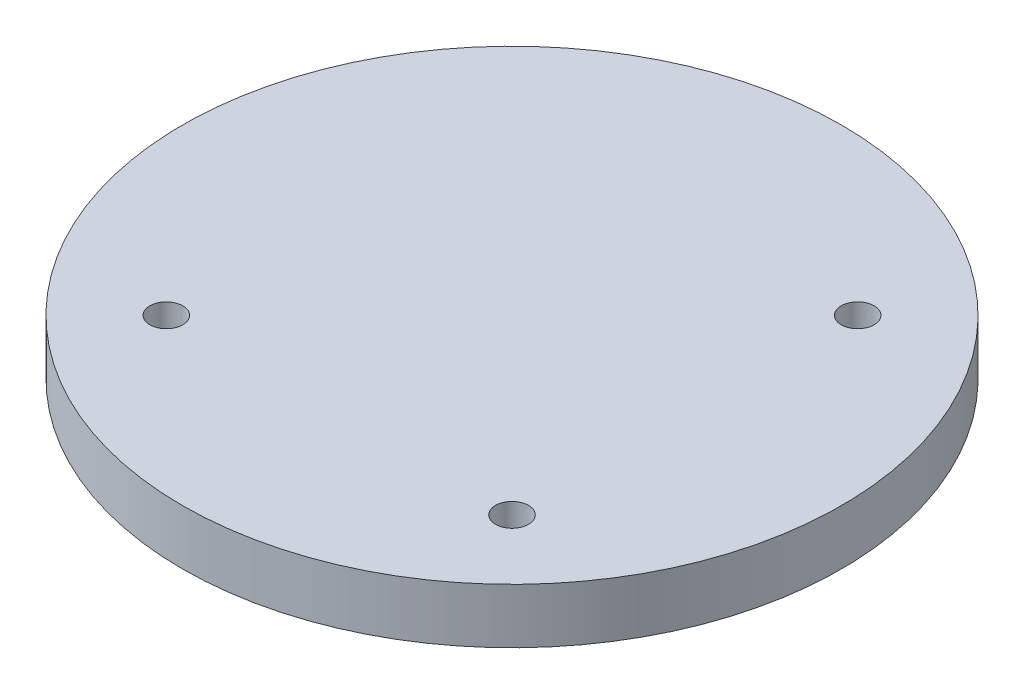
ISO-10303-21;
HEADER;
FILE_DESCRIPTION(('STEP AP214'),'2;1');
FILE_NAME('part.step','',(''),(''),'','','');
FILE_SCHEMA(('AUTOMOTIVE_DESIGN { 1 0 10303 214 1 1 1 1 }'));
ENDSEC;
DATA;
#1=APPLICATION_CONTEXT('core data for automotive mechanical design processes');
#2=APPLICATION_PROTOCOL_DEFINITION('international standard','automotive_design',2000,#1);
#3=PRODUCT_CONTEXT('',#1,'mechanical');
#4=PRODUCT('Part','Part','',(#3));
#5=PRODUCT_RELATED_PRODUCT_CATEGORY('part','',(#4));
#6=PRODUCT_DEFINITION_FORMATION('','',#4);
#7=PRODUCT_DEFINITION_CONTEXT('part definition',#1,'design');
#8=PRODUCT_DEFINITION('design','',#6,#7);
#9=PRODUCT_DEFINITION_SHAPE('','',#8);
#10=(LENGTH_UNIT() NAMED_UNIT(*) SI_UNIT(.MILLI.,.METRE.));
#11=(NAMED_UNIT(*) PLANE_ANGLE_UNIT() SI_UNIT($,.RADIAN.));
#12=(NAMED_UNIT(*) SI_UNIT($,.STERADIAN.) SOLID_ANGLE_UNIT());
#13=UNCERTAINTY_MEASURE_WITH_UNIT(LENGTH_MEASURE(1.E-05),#10,'distance_accuracy_value','');
#14=(GEOMETRIC_REPRESENTATION_CONTEXT(3) GLOBAL_UNCERTAINTY_ASSIGNED_CONTEXT((#13)) GLOBAL_UNIT_ASSIGNED_CONTEXT((#10,
#11,#12)) REPRESENTATION_CONTEXT('',''));
#15=CARTESIAN_POINT('',(0.,0.,0.));
#16=DIRECTION('',(0.,0.,1.));
#17=DIRECTION('',(1.,0.,0.));
#18=AXIS2_PLACEMENT_3D('',#15,#16,#17);
#19=CARTESIAN_POINT('',(0.,5.,0.));
#20=DIRECTION('',(0.,-1.,0.));
#21=DIRECTION('',(0.,0.,-1.));
#22=AXIS2_PLACEMENT_3D('',#19,#20,#21);
#23=CYLINDRICAL_SURFACE('',#22,30.);
#24=CARTESIAN_POINT('',(0.,5.,0.));
#25=DIRECTION('',(0.,1.,0.));
#26=DIRECTION('',(0.,0.,1.));
#27=AXIS2_PLACEMENT_3D('',#24,#25,#26);
#28=CIRCLE('',#27,30.);
#29=CARTESIAN_POINT('',(0.,5.,30.));
#30=VERTEX_POINT('',#29);
#31=EDGE_CURVE('E10',#30,#30,#28,.T.);
#32=ORIENTED_EDGE('',*,*,#31,.F.);
#33=EDGE_LOOP('',(#32));
#34=FACE_BOUND('',#33,.T.);
#35=CARTESIAN_POINT('',(0.,0.,0.));
#36=DIRECTION('',(0.,1.,0.));
#37=DIRECTION('',(0.,0.,1.));
#38=AXIS2_PLACEMENT_3D('',#35,#36,#37);
#39=CIRCLE('',#38,30.);
#40=CARTESIAN_POINT('',(0.,0.,30.));
#41=VERTEX_POINT('',#40);
#42=EDGE_CURVE('E34',#41,#41,#39,.T.);
#43=ORIENTED_EDGE('',*,*,#42,.T.);
#44=EDGE_LOOP('',(#43));
#45=FACE_BOUND('',#44,.T.);
#46=ADVANCED_FACE('F31',(#34,#45),#23,.T.);
#47=CARTESIAN_POINT('',(0.,5.,0.));
#48=DIRECTION('',(0.,1.,0.));
#49=DIRECTION('',(0.,0.,1.));
#50=AXIS2_PLACEMENT_3D('',#47,#48,#49);
#51=PLANE('',#50);
#52=CARTESIAN_POINT('',(-15.7331258814007,5.,15.7331258814007));
#53=DIRECTION('',(0.,1.,0.));
#54=DIRECTION('',(0.,0.,1.));
#55=AXIS2_PLACEMENT_3D('',#52,#53,#54);
#56=CIRCLE('',#55,1.49999999999999);
#57=CARTESIAN_POINT('',(-15.7331258814007,5.,17.2331258814007));
#58=VERTEX_POINT('',#57);
#59=EDGE_CURVE('E57',#58,#58,#56,.T.);
#60=ORIENTED_EDGE('',*,*,#59,.F.);
#61=EDGE_LOOP('',(#60));
#62=FACE_BOUND('',#61,.T.);
#63=CARTESIAN_POINT('',(15.7331258814007,5.,15.7331258814007));
#64=DIRECTION('',(0.,1.,0.));
#65=DIRECTION('',(0.,0.,1.));
#66=AXIS2_PLACEMENT_3D('',#63,#64,#65);
#67=CIRCLE('',#66,1.49999999999999);
#68=CARTESIAN_POINT('',(15.7331258814007,5.,17.2331258814006));
#69=VERTEX_POINT('',#68);
#70=EDGE_CURVE('E51',#69,#69,#67,.T.);
#71=ORIENTED_EDGE('',*,*,#70,.F.);
#72=EDGE_LOOP('',(#71));
#73=FACE_BOUND('',#72,.T.);
#74=CARTESIAN_POINT('',(15.7331258814007,5.,-15.7331258814007));
#75=DIRECTION('',(0.,1.,0.));
#76=DIRECTION('',(0.,0.,1.));
#77=AXIS2_PLACEMENT_3D('',#74,#75,#76);
#78=CIRCLE('',#77,1.49999999999999);
#79=CARTESIAN_POINT('',(15.7331258814007,5.,-14.2331258814007));
#80=VERTEX_POINT('',#79);
#81=EDGE_CURVE('E45',#80,#80,#78,.T.);
#82=ORIENTED_EDGE('',*,*,#81,.F.);
#83=EDGE_LOOP('',(#82));
#84=FACE_BOUND('',#83,.T.);
#85=ORIENTED_EDGE('',*,*,#31,.T.);
#86=EDGE_LOOP('',(#85));
#87=FACE_BOUND('',#86,.T.);
#88=ADVANCED_FACE('F63',(#62,#73,#84,#87),#51,.T.);
#89=CARTESIAN_POINT('',(0.,0.,0.));
#90=DIRECTION('',(0.,1.,0.));
#91=DIRECTION('',(0.,0.,1.));
#92=AXIS2_PLACEMENT_3D('',#89,#90,#91);
#93=PLANE('',#92);
#94=CARTESIAN_POINT('',(-15.7331258814007,0.,15.7331258814007));
#95=DIRECTION('',(0.,1.,0.));
#96=DIRECTION('',(0.,0.,1.));
#97=AXIS2_PLACEMENT_3D('',#94,#95,#96);
#98=CIRCLE('',#97,1.49999999999999);
#99=CARTESIAN_POINT('',(-15.7331258814007,0.,17.2331258814007));
#100=VERTEX_POINT('',#99);
#101=EDGE_CURVE('E54',#100,#100,#98,.T.);
#102=ORIENTED_EDGE('',*,*,#101,.T.);
#103=EDGE_LOOP('',(#102));
#104=FACE_BOUND('',#103,.T.);
#105=CARTESIAN_POINT('',(15.7331258814007,0.,15.7331258814007));
#106=DIRECTION('',(0.,1.,0.));
#107=DIRECTION('',(0.,0.,1.));
#108=AXIS2_PLACEMENT_3D('',#105,#106,#107);
#109=CIRCLE('',#108,1.49999999999999);
#110=CARTESIAN_POINT('',(15.7331258814007,0.,17.2331258814006));
#111=VERTEX_POINT('',#110);
#112=EDGE_CURVE('E48',#111,#111,#109,.T.);
#113=ORIENTED_EDGE('',*,*,#112,.T.);
#114=EDGE_LOOP('',(#113));
#115=FACE_BOUND('',#114,.T.);
#116=CARTESIAN_POINT('',(15.7331258814007,0.,-15.7331258814007));
#117=DIRECTION('',(0.,1.,0.));
#118=DIRECTION('',(0.,0.,1.));
#119=AXIS2_PLACEMENT_3D('',#116,#117,#118);
#120=CIRCLE('',#119,1.49999999999999);
#121=CARTESIAN_POINT('',(15.7331258814007,0.,-14.2331258814007));
#122=VERTEX_POINT('',#121);
#123=EDGE_CURVE('E41',#122,#122,#120,.T.);
#124=ORIENTED_EDGE('',*,*,#123,.T.);
#125=EDGE_LOOP('',(#124));
#126=FACE_BOUND('',#125,.T.);
#127=ORIENTED_EDGE('',*,*,#42,.F.);
#128=EDGE_LOOP('',(#127));
#129=FACE_BOUND('',#128,.T.);
#130=ADVANCED_FACE('F66',(#104,#115,#126,#129),#93,.F.);
#131=CARTESIAN_POINT('',(15.7331258814007,5.,-15.7331258814007));
#132=DIRECTION('',(0.,1.,0.));
#133=DIRECTION('',(0.,0.,1.));
#134=AXIS2_PLACEMENT_3D('',#131,#132,#133);
#135=CYLINDRICAL_SURFACE('',#134,1.49999999999999);
#136=ORIENTED_EDGE('',*,*,#123,.F.);
#137=EDGE_LOOP('',(#136));
#138=FACE_BOUND('',#137,.T.);
#139=ORIENTED_EDGE('',*,*,#81,.T.);
#140=EDGE_LOOP('',(#139));
#141=FACE_BOUND('',#140,.T.);
#142=ADVANCED_FACE('F72',(#138,#141),#135,.F.);
#143=CARTESIAN_POINT('',(15.7331258814007,5.,15.7331258814007));
#144=DIRECTION('',(0.,1.,0.));
#145=DIRECTION('',(0.,0.,1.));
#146=AXIS2_PLACEMENT_3D('',#143,#144,#145);
#147=CYLINDRICAL_SURFACE('',#146,1.49999999999999);
#148=ORIENTED_EDGE('',*,*,#112,.F.);
#149=EDGE_LOOP('',(#148));
#150=FACE_BOUND('',#149,.T.);
#151=ORIENTED_EDGE('',*,*,#70,.T.);
#152=EDGE_LOOP('',(#151));
#153=FACE_BOUND('',#152,.T.);
#154=ADVANCED_FACE('F74',(#150,#153),#147,.F.);
#155=CARTESIAN_POINT('',(-15.7331258814007,5.,15.7331258814007));
#156=DIRECTION('',(0.,1.,0.));
#157=DIRECTION('',(0.,0.,1.));
#158=AXIS2_PLACEMENT_3D('',#155,#156,#157);
#159=CYLINDRICAL_SURFACE('',#158,1.49999999999999);
#160=ORIENTED_EDGE('',*,*,#101,.F.);
#161=EDGE_LOOP('',(#160));
#162=FACE_BOUND('',#161,.T.);
#163=ORIENTED_EDGE('',*,*,#59,.T.);
#164=EDGE_LOOP('',(#163));
#165=FACE_BOUND('',#164,.T.);
#166=ADVANCED_FACE('F61',(#162,#165),#159,.F.);
#167=CLOSED_SHELL('',(#46,#88,#130,#142,#154,#166));
#168=MANIFOLD_SOLID_BREP('B2',#167);
#169=ADVANCED_BREP_SHAPE_REPRESENTATION('',(#18,#168),#14);
#170=SHAPE_DEFINITION_REPRESENTATION(#9,#169);
ENDSEC;
END-ISO-10303-21;
